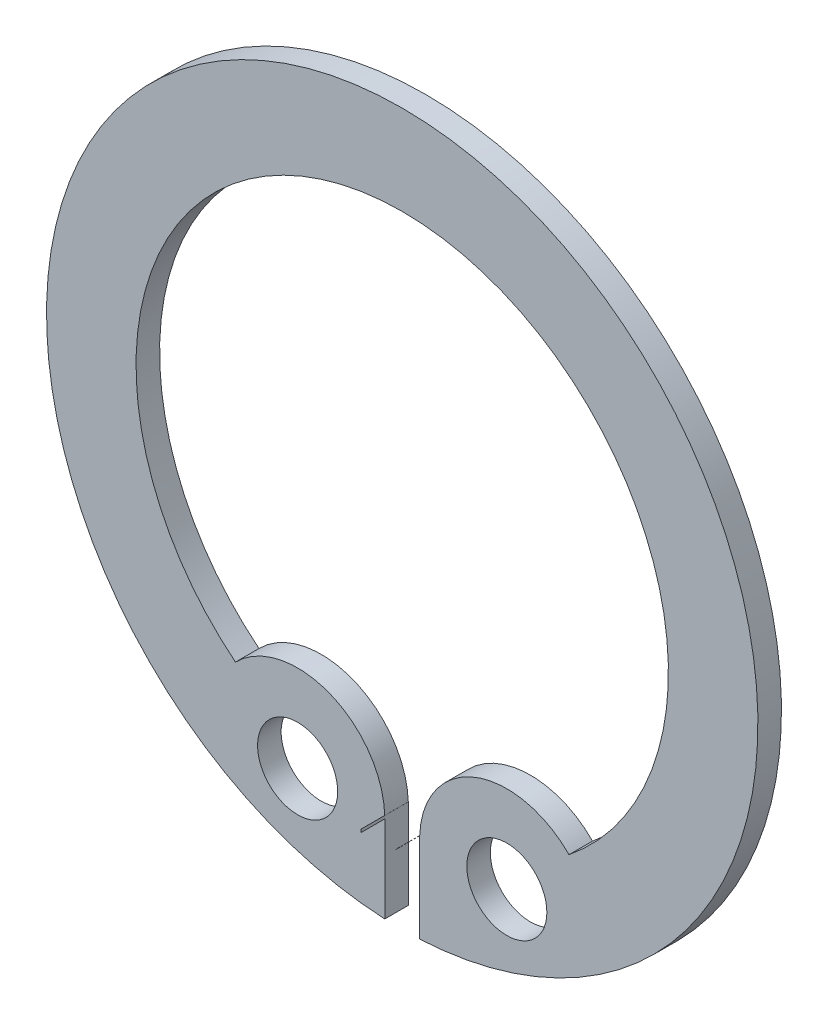
ISO-10303-21;
HEADER;
FILE_DESCRIPTION(('STEP AP214'),'2;1');
FILE_NAME('part.step','',(''),(''),'','','');
FILE_SCHEMA(('AUTOMOTIVE_DESIGN { 1 0 10303 214 1 1 1 1 }'));
ENDSEC;
DATA;
#1=APPLICATION_CONTEXT('core data for automotive mechanical design processes');
#2=APPLICATION_PROTOCOL_DEFINITION('international standard','automotive_design',2000,#1);
#3=PRODUCT_CONTEXT('',#1,'mechanical');
#4=PRODUCT('Part','Part','',(#3));
#5=PRODUCT_RELATED_PRODUCT_CATEGORY('part','',(#4));
#6=PRODUCT_DEFINITION_FORMATION('','',#4);
#7=PRODUCT_DEFINITION_CONTEXT('part definition',#1,'design');
#8=PRODUCT_DEFINITION('design','',#6,#7);
#9=PRODUCT_DEFINITION_SHAPE('','',#8);
#10=(LENGTH_UNIT() NAMED_UNIT(*) SI_UNIT(.MILLI.,.METRE.));
#11=(NAMED_UNIT(*) PLANE_ANGLE_UNIT() SI_UNIT($,.RADIAN.));
#12=(NAMED_UNIT(*) SI_UNIT($,.STERADIAN.) SOLID_ANGLE_UNIT());
#13=UNCERTAINTY_MEASURE_WITH_UNIT(LENGTH_MEASURE(1.E-05),#10,'distance_accuracy_value','');
#14=(GEOMETRIC_REPRESENTATION_CONTEXT(3) GLOBAL_UNCERTAINTY_ASSIGNED_CONTEXT((#13)) GLOBAL_UNIT_ASSIGNED_CONTEXT((#10,
#11,#12)) REPRESENTATION_CONTEXT('',''));
#15=CARTESIAN_POINT('',(0.,0.,0.));
#16=DIRECTION('',(0.,0.,1.));
#17=DIRECTION('',(1.,0.,0.));
#18=AXIS2_PLACEMENT_3D('',#15,#16,#17);
#19=CARTESIAN_POINT('',(2.22,-5.7,0.5));
#20=DIRECTION('',(0.,0.,-1.));
#21=DIRECTION('',(1.,0.,0.));
#22=AXIS2_PLACEMENT_3D('',#19,#20,#21);
#23=CYLINDRICAL_SURFACE('',#22,0.85);
#24=CARTESIAN_POINT('',(2.22,-5.7,0.));
#25=DIRECTION('',(0.,0.,1.));
#26=DIRECTION('',(1.,0.,0.));
#27=AXIS2_PLACEMENT_3D('',#24,#25,#26);
#28=CIRCLE('',#27,0.85);
#29=CARTESIAN_POINT('',(3.07,-5.7,0.));
#30=VERTEX_POINT('',#29);
#31=EDGE_CURVE('E193',#30,#30,#28,.T.);
#32=ORIENTED_EDGE('',*,*,#31,.F.);
#33=EDGE_LOOP('',(#32));
#34=FACE_BOUND('',#33,.T.);
#35=CARTESIAN_POINT('',(2.22,-5.7,0.5));
#36=DIRECTION('',(0.,0.,1.));
#37=DIRECTION('',(1.,0.,0.));
#38=AXIS2_PLACEMENT_3D('',#35,#36,#37);
#39=CIRCLE('',#38,0.85);
#40=CARTESIAN_POINT('',(3.07,-5.7,0.5));
#41=VERTEX_POINT('',#40);
#42=EDGE_CURVE('E371',#41,#41,#39,.T.);
#43=ORIENTED_EDGE('',*,*,#42,.T.);
#44=EDGE_LOOP('',(#43));
#45=FACE_BOUND('',#44,.T.);
#46=ADVANCED_FACE('F39',(#34,#45),#23,.F.);
#47=CARTESIAN_POINT('',(-2.22,-5.7,0.5));
#48=DIRECTION('',(0.,0.,-1.));
#49=DIRECTION('',(1.,0.,0.));
#50=AXIS2_PLACEMENT_3D('',#47,#48,#49);
#51=CYLINDRICAL_SURFACE('',#50,0.85);
#52=CARTESIAN_POINT('',(-2.22,-5.7,0.));
#53=DIRECTION('',(0.,0.,1.));
#54=DIRECTION('',(1.,0.,0.));
#55=AXIS2_PLACEMENT_3D('',#52,#53,#54);
#56=CIRCLE('',#55,0.85);
#57=CARTESIAN_POINT('',(-1.37,-5.7,0.));
#58=VERTEX_POINT('',#57);
#59=EDGE_CURVE('E172',#58,#58,#56,.T.);
#60=ORIENTED_EDGE('',*,*,#59,.F.);
#61=EDGE_LOOP('',(#60));
#62=FACE_BOUND('',#61,.T.);
#63=CARTESIAN_POINT('',(-2.22,-5.7,0.5));
#64=DIRECTION('',(0.,0.,1.));
#65=DIRECTION('',(1.,0.,0.));
#66=AXIS2_PLACEMENT_3D('',#63,#64,#65);
#67=CIRCLE('',#66,0.85);
#68=CARTESIAN_POINT('',(-1.37,-5.7,0.5));
#69=VERTEX_POINT('',#68);
#70=EDGE_CURVE('E205',#69,#69,#67,.T.);
#71=ORIENTED_EDGE('',*,*,#70,.T.);
#72=EDGE_LOOP('',(#71));
#73=FACE_BOUND('',#72,.T.);
#74=ADVANCED_FACE('F281',(#62,#73),#51,.F.);
#75=CARTESIAN_POINT('',(2.22,-5.7,0.5));
#76=DIRECTION('',(0.,0.,-1.));
#77=DIRECTION('',(1.,0.,0.));
#78=AXIS2_PLACEMENT_3D('',#75,#76,#77);
#79=CYLINDRICAL_SURFACE('',#78,1.85);
#80=DIRECTION('',(0.,0.,-1.));
#81=VECTOR('',#80,1.);
#82=CARTESIAN_POINT('',(0.371045820220719,-5.6378032068614,0.5));
#83=LINE('',#82,#81);
#84=CARTESIAN_POINT('',(0.371045820220719,-5.6378032068614,0.5));
#85=VERTEX_POINT('',#84);
#86=CARTESIAN_POINT('',(0.371045820220719,-5.6378032068614,0.));
#87=VERTEX_POINT('',#86);
#88=EDGE_CURVE('E185',#85,#87,#83,.T.);
#89=ORIENTED_EDGE('',*,*,#88,.F.);
#90=CARTESIAN_POINT('',(2.22,-5.7,0.5));
#91=DIRECTION('',(0.,0.,1.));
#92=DIRECTION('',(1.,0.,0.));
#93=AXIS2_PLACEMENT_3D('',#90,#91,#92);
#94=CIRCLE('',#93,1.85);
#95=CARTESIAN_POINT('',(3.53983353325244,-4.40364378178589,0.5));
#96=VERTEX_POINT('',#95);
#97=EDGE_CURVE('E57',#85,#96,#94,.F.);
#98=ORIENTED_EDGE('',*,*,#97,.T.);
#99=DIRECTION('',(0.,0.,1.));
#100=VECTOR('',#99,1.);
#101=CARTESIAN_POINT('',(3.53983353325244,-4.40364378178589,0.5));
#102=LINE('',#101,#100);
#103=CARTESIAN_POINT('',(3.53983353325244,-4.40364378178589,0.));
#104=VERTEX_POINT('',#103);
#105=EDGE_CURVE('E173',#104,#96,#102,.T.);
#106=ORIENTED_EDGE('',*,*,#105,.F.);
#107=CARTESIAN_POINT('',(2.22,-5.7,0.));
#108=DIRECTION('',(0.,0.,1.));
#109=DIRECTION('',(1.,0.,0.));
#110=AXIS2_PLACEMENT_3D('',#107,#108,#109);
#111=CIRCLE('',#110,1.85);
#112=EDGE_CURVE('E162',#104,#87,#111,.T.);
#113=ORIENTED_EDGE('',*,*,#112,.T.);
#114=EDGE_LOOP('',(#89,#98,#106,#113));
#115=FACE_BOUND('',#114,.T.);
#116=ADVANCED_FACE('F215',(#115),#79,.T.);
#117=CARTESIAN_POINT('',(0.,0.,1.));
#118=DIRECTION('',(0.,0.,1.));
#119=DIRECTION('',(1.,0.,0.));
#120=AXIS2_PLACEMENT_3D('',#117,#118,#119);
#121=PLANE('',#120);
#122=CARTESIAN_POINT('',(2.22,-5.7,1.));
#123=DIRECTION('',(0.,0.,1.));
#124=DIRECTION('',(1.,0.,0.));
#125=AXIS2_PLACEMENT_3D('',#122,#123,#124);
#126=CIRCLE('',#125,1.85093904122967);
#127=CARTESIAN_POINT('',(0.370104168133009,-5.63786510167905,1.));
#128=VERTEX_POINT('',#127);
#129=CARTESIAN_POINT('',(0.370000000000001,-5.64104803355083,1.));
#130=VERTEX_POINT('',#129);
#131=EDGE_CURVE('E201',#128,#130,#126,.T.);
#132=ORIENTED_EDGE('',*,*,#131,.F.);
#133=CARTESIAN_POINT('',(0.,0.,1.));
#134=DIRECTION('',(0.,0.,-1.));
#135=DIRECTION('',(1.,0.,0.));
#136=AXIS2_PLACEMENT_3D('',#133,#134,#135);
#137=CIRCLE('',#136,5.65);
#138=CARTESIAN_POINT('',(0.37,-5.63787193895001,1.));
#139=VERTEX_POINT('',#138);
#140=EDGE_CURVE('E180',#128,#139,#137,.T.);
#141=ORIENTED_EDGE('',*,*,#140,.T.);
#142=DIRECTION('',(0.,-1.,0.));
#143=VECTOR('',#142,1.);
#144=CARTESIAN_POINT('',(0.37,-3.29696798473751,1.));
#145=LINE('',#144,#143);
#146=EDGE_CURVE('E183',#139,#130,#145,.T.);
#147=ORIENTED_EDGE('',*,*,#146,.T.);
#148=EDGE_LOOP('',(#132,#141,#147));
#149=FACE_BOUND('',#148,.T.);
#150=ADVANCED_FACE('F238',(#149),#121,.T.);
#151=CARTESIAN_POINT('',(0.,0.,0.));
#152=DIRECTION('',(0.,0.,-1.));
#153=DIRECTION('',(1.,0.,0.));
#154=AXIS2_PLACEMENT_3D('',#151,#152,#153);
#155=CYLINDRICAL_SURFACE('',#154,5.65);
#156=ORIENTED_EDGE('',*,*,#105,.T.);
#157=CARTESIAN_POINT('',(0.,0.,0.5));
#158=DIRECTION('',(0.,0.,-1.));
#159=DIRECTION('',(1.,0.,0.));
#160=AXIS2_PLACEMENT_3D('',#157,#158,#159);
#161=CIRCLE('',#160,5.65);
#162=CARTESIAN_POINT('',(-3.53983353325244,-4.40364378178589,0.5));
#163=VERTEX_POINT('',#162);
#164=EDGE_CURVE('E209',#163,#96,#161,.T.);
#165=ORIENTED_EDGE('',*,*,#164,.F.);
#166=DIRECTION('',(0.,0.,-1.));
#167=VECTOR('',#166,1.);
#168=CARTESIAN_POINT('',(-3.53983353325244,-4.40364378178589,0.5));
#169=LINE('',#168,#167);
#170=CARTESIAN_POINT('',(-3.53983353325244,-4.40364378178589,0.));
#171=VERTEX_POINT('',#170);
#172=EDGE_CURVE('E176',#163,#171,#169,.T.);
#173=ORIENTED_EDGE('',*,*,#172,.T.);
#174=CARTESIAN_POINT('',(0.,0.,0.));
#175=DIRECTION('',(0.,0.,1.));
#176=DIRECTION('',(1.,0.,0.));
#177=AXIS2_PLACEMENT_3D('',#174,#175,#176);
#178=CIRCLE('',#177,5.65);
#179=EDGE_CURVE('E166',#104,#171,#178,.T.);
#180=ORIENTED_EDGE('',*,*,#179,.F.);
#181=EDGE_LOOP('',(#156,#165,#173,#180));
#182=FACE_BOUND('',#181,.T.);
#183=ADVANCED_FACE('F220',(#182),#155,.F.);
#184=CARTESIAN_POINT('',(-2.22,-5.7,0.5));
#185=DIRECTION('',(0.,0.,-1.));
#186=DIRECTION('',(1.,0.,0.));
#187=AXIS2_PLACEMENT_3D('',#184,#185,#186);
#188=CYLINDRICAL_SURFACE('',#187,1.85);
#189=ORIENTED_EDGE('',*,*,#172,.F.);
#190=CARTESIAN_POINT('',(-2.22,-5.7,0.5));
#191=DIRECTION('',(0.,0.,1.));
#192=DIRECTION('',(1.,0.,0.));
#193=AXIS2_PLACEMENT_3D('',#190,#191,#192);
#194=CIRCLE('',#193,1.85);
#195=CARTESIAN_POINT('',(-0.371045820220717,-5.6378032068614,0.5));
#196=VERTEX_POINT('',#195);
#197=EDGE_CURVE('E264',#196,#163,#194,.T.);
#198=ORIENTED_EDGE('',*,*,#197,.F.);
#199=DIRECTION('',(0.,0.,1.));
#200=VECTOR('',#199,1.);
#201=CARTESIAN_POINT('',(-0.371045820220719,-5.6378032068614,0.5));
#202=LINE('',#201,#200);
#203=CARTESIAN_POINT('',(-0.371045820220719,-5.6378032068614,0.));
#204=VERTEX_POINT('',#203);
#205=EDGE_CURVE('E151',#204,#196,#202,.T.);
#206=ORIENTED_EDGE('',*,*,#205,.F.);
#207=CARTESIAN_POINT('',(-2.22,-5.7,0.));
#208=DIRECTION('',(0.,0.,1.));
#209=DIRECTION('',(1.,0.,0.));
#210=AXIS2_PLACEMENT_3D('',#207,#208,#209);
#211=CIRCLE('',#210,1.85);
#212=EDGE_CURVE('E153',#204,#171,#211,.T.);
#213=ORIENTED_EDGE('',*,*,#212,.T.);
#214=EDGE_LOOP('',(#189,#198,#206,#213));
#215=FACE_BOUND('',#214,.T.);
#216=ADVANCED_FACE('F269',(#215),#188,.T.);
#217=CARTESIAN_POINT('',(0.,0.,0.5));
#218=DIRECTION('',(0.,0.,-1.));
#219=DIRECTION('',(1.,0.,0.));
#220=AXIS2_PLACEMENT_3D('',#217,#218,#219);
#221=CYLINDRICAL_SURFACE('',#220,7.55);
#222=DIRECTION('',(0.,0.,1.));
#223=VECTOR('',#222,1.);
#224=CARTESIAN_POINT('',(-0.37,-7.54092832481519,0.5));
#225=LINE('',#224,#223);
#226=CARTESIAN_POINT('',(-0.37,-7.54092832481519,0.));
#227=VERTEX_POINT('',#226);
#228=CARTESIAN_POINT('',(-0.37,-7.54092832481519,0.5));
#229=VERTEX_POINT('',#228);
#230=EDGE_CURVE('E144',#227,#229,#225,.T.);
#231=ORIENTED_EDGE('',*,*,#230,.T.);
#232=CARTESIAN_POINT('',(0.,0.,0.5));
#233=DIRECTION('',(0.,0.,1.));
#234=DIRECTION('',(1.,0.,0.));
#235=AXIS2_PLACEMENT_3D('',#232,#233,#234);
#236=CIRCLE('',#235,7.55);
#237=CARTESIAN_POINT('',(0.37,-7.54092832481519,0.5));
#238=VERTEX_POINT('',#237);
#239=EDGE_CURVE('E130',#238,#229,#236,.T.);
#240=ORIENTED_EDGE('',*,*,#239,.F.);
#241=DIRECTION('',(0.,0.,-1.));
#242=VECTOR('',#241,1.);
#243=CARTESIAN_POINT('',(0.37,-7.54092832481519,0.5));
#244=LINE('',#243,#242);
#245=CARTESIAN_POINT('',(0.37,-7.54092832481519,0.));
#246=VERTEX_POINT('',#245);
#247=EDGE_CURVE('E141',#238,#246,#244,.T.);
#248=ORIENTED_EDGE('',*,*,#247,.T.);
#249=CARTESIAN_POINT('',(0.,0.,0.));
#250=DIRECTION('',(0.,0.,-1.));
#251=DIRECTION('',(1.,0.,0.));
#252=AXIS2_PLACEMENT_3D('',#249,#250,#251);
#253=CIRCLE('',#252,7.55);
#254=EDGE_CURVE('E160',#227,#246,#253,.T.);
#255=ORIENTED_EDGE('',*,*,#254,.F.);
#256=EDGE_LOOP('',(#231,#240,#248,#255));
#257=FACE_BOUND('',#256,.T.);
#258=ADVANCED_FACE('F140',(#257),#221,.T.);
#259=CARTESIAN_POINT('',(-0.37,-6.59393596947501,0.));
#260=DIRECTION('',(-1.,0.,0.));
#261=DIRECTION('',(0.,-1.,0.));
#262=AXIS2_PLACEMENT_3D('',#259,#260,#261);
#263=PLANE('',#262);
#264=DIRECTION('',(0.,0.,1.));
#265=VECTOR('',#264,1.);
#266=CARTESIAN_POINT('',(-0.369999999999998,-5.7,0.5));
#267=LINE('',#266,#265);
#268=CARTESIAN_POINT('',(-0.369999999999998,-5.7,0.5));
#269=VERTEX_POINT('',#268);
#270=CARTESIAN_POINT('',(-0.369999999999998,-5.7,1.));
#271=VERTEX_POINT('',#270);
#272=EDGE_CURVE('E212',#269,#271,#267,.T.);
#273=ORIENTED_EDGE('',*,*,#272,.F.);
#274=DIRECTION('',(0.,1.,0.));
#275=VECTOR('',#274,1.);
#276=CARTESIAN_POINT('',(-0.369999999999998,-5.7,0.5));
#277=LINE('',#276,#275);
#278=EDGE_CURVE('E145',#229,#269,#277,.T.);
#279=ORIENTED_EDGE('',*,*,#278,.F.);
#280=ORIENTED_EDGE('',*,*,#230,.F.);
#281=DIRECTION('',(0.,-1.,0.));
#282=VECTOR('',#281,1.);
#283=CARTESIAN_POINT('',(-0.37,-3.29696798473751,0.));
#284=LINE('',#283,#282);
#285=CARTESIAN_POINT('',(-0.37,-5.63787193895001,0.));
#286=VERTEX_POINT('',#285);
#287=EDGE_CURVE('E179',#286,#227,#284,.T.);
#288=ORIENTED_EDGE('',*,*,#287,.F.);
#289=DIRECTION('',(0.,0.,1.));
#290=VECTOR('',#289,1.);
#291=CARTESIAN_POINT('',(-0.37,-5.63787193895001,0.));
#292=LINE('',#291,#290);
#293=CARTESIAN_POINT('',(-0.37,-5.63787193895001,1.));
#294=VERTEX_POINT('',#293);
#295=EDGE_CURVE('E156',#286,#294,#292,.T.);
#296=ORIENTED_EDGE('',*,*,#295,.T.);
#297=DIRECTION('',(0.,1.,0.));
#298=VECTOR('',#297,1.);
#299=CARTESIAN_POINT('',(-0.37,-3.29696798473751,1.));
#300=LINE('',#299,#298);
#301=EDGE_CURVE('E165',#271,#294,#300,.T.);
#302=ORIENTED_EDGE('',*,*,#301,.F.);
#303=EDGE_LOOP('',(#273,#279,#280,#288,#296,#302));
#304=FACE_BOUND('',#303,.T.);
#305=ADVANCED_FACE('F263',(#304),#263,.F.);
#306=CARTESIAN_POINT('',(0.37,-6.59393596947501,0.));
#307=DIRECTION('',(1.,0.,0.));
#308=DIRECTION('',(0.,1.,0.));
#309=AXIS2_PLACEMENT_3D('',#306,#307,#308);
#310=PLANE('',#309);
#311=DIRECTION('',(0.,1.,0.));
#312=VECTOR('',#311,1.);
#313=CARTESIAN_POINT('',(0.37,-5.7,0.5));
#314=LINE('',#313,#312);
#315=CARTESIAN_POINT('',(0.37,-5.64104803355086,0.5));
#316=VERTEX_POINT('',#315);
#317=EDGE_CURVE('E43',#316,#238,#314,.F.);
#318=ORIENTED_EDGE('',*,*,#317,.F.);
#319=DIRECTION('',(0.,0.,1.));
#320=VECTOR('',#319,1.);
#321=CARTESIAN_POINT('',(0.37,-5.64104803355086,0.5));
#322=LINE('',#321,#320);
#323=EDGE_CURVE('E137',#316,#130,#322,.T.);
#324=ORIENTED_EDGE('',*,*,#323,.T.);
#325=ORIENTED_EDGE('',*,*,#146,.F.);
#326=DIRECTION('',(0.,0.,1.));
#327=VECTOR('',#326,1.);
#328=CARTESIAN_POINT('',(0.37,-5.63787193895001,0.));
#329=LINE('',#328,#327);
#330=CARTESIAN_POINT('',(0.37,-5.63787193895001,0.));
#331=VERTEX_POINT('',#330);
#332=EDGE_CURVE('E187',#331,#139,#329,.T.);
#333=ORIENTED_EDGE('',*,*,#332,.F.);
#334=DIRECTION('',(0.,1.,0.));
#335=VECTOR('',#334,1.);
#336=CARTESIAN_POINT('',(0.37,-3.29696798473751,0.));
#337=LINE('',#336,#335);
#338=EDGE_CURVE('E149',#246,#331,#337,.T.);
#339=ORIENTED_EDGE('',*,*,#338,.F.);
#340=ORIENTED_EDGE('',*,*,#247,.F.);
#341=EDGE_LOOP('',(#318,#324,#325,#333,#339,#340));
#342=FACE_BOUND('',#341,.T.);
#343=ADVANCED_FACE('F147',(#342),#310,.F.);
#344=CARTESIAN_POINT('',(-2.22,-5.7,1.));
#345=DIRECTION('',(0.,0.,1.));
#346=DIRECTION('',(1.,0.,0.));
#347=AXIS2_PLACEMENT_3D('',#344,#345,#346);
#348=CIRCLE('',#347,1.85);
#349=CARTESIAN_POINT('',(-0.371045820220717,-5.6378032068614,1.));
#350=VERTEX_POINT('',#349);
#351=EDGE_CURVE('E204',#271,#350,#348,.T.);
#352=ORIENTED_EDGE('',*,*,#351,.F.);
#353=ORIENTED_EDGE('',*,*,#301,.T.);
#354=CARTESIAN_POINT('',(0.,0.,1.));
#355=DIRECTION('',(0.,0.,-1.));
#356=DIRECTION('',(1.,0.,0.));
#357=AXIS2_PLACEMENT_3D('',#354,#355,#356);
#358=CIRCLE('',#357,5.65);
#359=EDGE_CURVE('E182',#294,#350,#358,.T.);
#360=ORIENTED_EDGE('',*,*,#359,.T.);
#361=EDGE_LOOP('',(#352,#353,#360));
#362=FACE_BOUND('',#361,.T.);
#363=ADVANCED_FACE('F251',(#362),#121,.T.);
#364=CARTESIAN_POINT('',(0.,0.,0.));
#365=DIRECTION('',(0.,0.,-1.));
#366=DIRECTION('',(-1.,0.,0.));
#367=AXIS2_PLACEMENT_3D('',#364,#365,#366);
#368=PLANE('',#367);
#369=ORIENTED_EDGE('',*,*,#31,.T.);
#370=EDGE_LOOP('',(#369));
#371=FACE_BOUND('',#370,.T.);
#372=ORIENTED_EDGE('',*,*,#59,.T.);
#373=EDGE_LOOP('',(#372));
#374=FACE_BOUND('',#373,.T.);
#375=ORIENTED_EDGE('',*,*,#338,.T.);
#376=CARTESIAN_POINT('',(0.,0.,0.));
#377=DIRECTION('',(0.,0.,1.));
#378=DIRECTION('',(1.,0.,0.));
#379=AXIS2_PLACEMENT_3D('',#376,#377,#378);
#380=CIRCLE('',#379,5.65);
#381=EDGE_CURVE('E169',#331,#87,#380,.T.);
#382=ORIENTED_EDGE('',*,*,#381,.T.);
#383=ORIENTED_EDGE('',*,*,#112,.F.);
#384=ORIENTED_EDGE('',*,*,#179,.T.);
#385=ORIENTED_EDGE('',*,*,#212,.F.);
#386=CARTESIAN_POINT('',(0.,0.,0.));
#387=DIRECTION('',(0.,0.,1.));
#388=DIRECTION('',(1.,0.,0.));
#389=AXIS2_PLACEMENT_3D('',#386,#387,#388);
#390=CIRCLE('',#389,5.65);
#391=EDGE_CURVE('E170',#204,#286,#390,.T.);
#392=ORIENTED_EDGE('',*,*,#391,.T.);
#393=ORIENTED_EDGE('',*,*,#287,.T.);
#394=ORIENTED_EDGE('',*,*,#254,.T.);
#395=EDGE_LOOP('',(#375,#382,#383,#384,#385,#392,#393,#394));
#396=FACE_BOUND('',#395,.T.);
#397=ADVANCED_FACE('F224',(#371,#374,#396),#368,.T.);
#398=CARTESIAN_POINT('',(0.,0.,0.));
#399=DIRECTION('',(0.,0.,-1.));
#400=DIRECTION('',(1.,0.,0.));
#401=AXIS2_PLACEMENT_3D('',#398,#399,#400);
#402=CYLINDRICAL_SURFACE('',#401,5.65);
#403=ORIENTED_EDGE('',*,*,#205,.T.);
#404=DIRECTION('',(0.,0.,1.));
#405=VECTOR('',#404,1.);
#406=CARTESIAN_POINT('',(-0.371045820220717,-5.6378032068614,0.75));
#407=LINE('',#406,#405);
#408=EDGE_CURVE('E199',#196,#350,#407,.T.);
#409=ORIENTED_EDGE('',*,*,#408,.T.);
#410=ORIENTED_EDGE('',*,*,#359,.F.);
#411=ORIENTED_EDGE('',*,*,#295,.F.);
#412=ORIENTED_EDGE('',*,*,#391,.F.);
#413=EDGE_LOOP('',(#403,#409,#410,#411,#412));
#414=FACE_BOUND('',#413,.T.);
#415=ADVANCED_FACE('F243',(#414),#402,.F.);
#416=CARTESIAN_POINT('',(0.,0.,0.));
#417=DIRECTION('',(0.,0.,-1.));
#418=DIRECTION('',(1.,0.,0.));
#419=AXIS2_PLACEMENT_3D('',#416,#417,#418);
#420=CYLINDRICAL_SURFACE('',#419,5.65);
#421=ORIENTED_EDGE('',*,*,#140,.F.);
#422=DIRECTION('',(0.,0.,1.));
#423=VECTOR('',#422,1.);
#424=CARTESIAN_POINT('',(0.370104168133009,-5.63786510167905,0.75));
#425=LINE('',#424,#423);
#426=CARTESIAN_POINT('',(0.370104168133009,-5.63786510167905,0.5));
#427=VERTEX_POINT('',#426);
#428=EDGE_CURVE('E11',#128,#427,#425,.F.);
#429=ORIENTED_EDGE('',*,*,#428,.T.);
#430=CARTESIAN_POINT('',(0.,0.,0.5));
#431=DIRECTION('',(0.,0.,1.));
#432=DIRECTION('',(1.,0.,0.));
#433=AXIS2_PLACEMENT_3D('',#430,#431,#432);
#434=CIRCLE('',#433,5.65);
#435=EDGE_CURVE('E49',#85,#427,#434,.F.);
#436=ORIENTED_EDGE('',*,*,#435,.F.);
#437=ORIENTED_EDGE('',*,*,#88,.T.);
#438=ORIENTED_EDGE('',*,*,#381,.F.);
#439=ORIENTED_EDGE('',*,*,#332,.T.);
#440=EDGE_LOOP('',(#421,#429,#436,#437,#438,#439));
#441=FACE_BOUND('',#440,.T.);
#442=ADVANCED_FACE('F41',(#441),#420,.F.);
#443=CARTESIAN_POINT('',(-2.22,-5.7,0.5));
#444=DIRECTION('',(0.,0.,1.));
#445=DIRECTION('',(1.,0.,0.));
#446=AXIS2_PLACEMENT_3D('',#443,#444,#445);
#447=CYLINDRICAL_SURFACE('',#446,1.85);
#448=EDGE_CURVE('E266',#269,#196,#194,.T.);
#449=ORIENTED_EDGE('',*,*,#448,.F.);
#450=ORIENTED_EDGE('',*,*,#272,.T.);
#451=ORIENTED_EDGE('',*,*,#351,.T.);
#452=ORIENTED_EDGE('',*,*,#408,.F.);
#453=EDGE_LOOP('',(#449,#450,#451,#452));
#454=FACE_BOUND('',#453,.T.);
#455=ADVANCED_FACE('F332',(#454),#447,.F.);
#456=CARTESIAN_POINT('',(2.22,-5.7,0.5));
#457=DIRECTION('',(0.,0.,1.));
#458=DIRECTION('',(1.,0.,0.));
#459=AXIS2_PLACEMENT_3D('',#456,#457,#458);
#460=CYLINDRICAL_SURFACE('',#459,1.85093904122967);
#461=CARTESIAN_POINT('',(2.22,-5.7,0.5));
#462=DIRECTION('',(0.,0.,1.));
#463=DIRECTION('',(1.,0.,0.));
#464=AXIS2_PLACEMENT_3D('',#461,#462,#463);
#465=CIRCLE('',#464,1.85093904122967);
#466=EDGE_CURVE('E133',#427,#316,#465,.T.);
#467=ORIENTED_EDGE('',*,*,#466,.F.);
#468=ORIENTED_EDGE('',*,*,#428,.F.);
#469=ORIENTED_EDGE('',*,*,#131,.T.);
#470=ORIENTED_EDGE('',*,*,#323,.F.);
#471=EDGE_LOOP('',(#467,#468,#469,#470));
#472=FACE_BOUND('',#471,.T.);
#473=ADVANCED_FACE('F232',(#472),#460,.F.);
#474=CARTESIAN_POINT('',(2.22,-5.7,0.5));
#475=DIRECTION('',(0.,0.,1.));
#476=DIRECTION('',(1.,0.,0.));
#477=AXIS2_PLACEMENT_3D('',#474,#475,#476);
#478=PLANE('',#477);
#479=ORIENTED_EDGE('',*,*,#42,.F.);
#480=EDGE_LOOP('',(#479));
#481=FACE_BOUND('',#480,.T.);
#482=ORIENTED_EDGE('',*,*,#70,.F.);
#483=EDGE_LOOP('',(#482));
#484=FACE_BOUND('',#483,.T.);
#485=ORIENTED_EDGE('',*,*,#317,.T.);
#486=ORIENTED_EDGE('',*,*,#239,.T.);
#487=ORIENTED_EDGE('',*,*,#278,.T.);
#488=ORIENTED_EDGE('',*,*,#448,.T.);
#489=ORIENTED_EDGE('',*,*,#197,.T.);
#490=ORIENTED_EDGE('',*,*,#164,.T.);
#491=ORIENTED_EDGE('',*,*,#97,.F.);
#492=ORIENTED_EDGE('',*,*,#435,.T.);
#493=ORIENTED_EDGE('',*,*,#466,.T.);
#494=EDGE_LOOP('',(#485,#486,#487,#488,#489,#490,#491,#492,#493));
#495=FACE_BOUND('',#494,.T.);
#496=ADVANCED_FACE('F128',(#481,#484,#495),#478,.T.);
#497=CLOSED_SHELL('',(#46,#74,#116,#150,#183,#216,#258,#305,#343,#363,#397,#415,#442,#455,#473,#496));
#498=MANIFOLD_SOLID_BREP('B2',#497);
#499=ADVANCED_BREP_SHAPE_REPRESENTATION('',(#18,#498),#14);
#500=SHAPE_DEFINITION_REPRESENTATION(#9,#499);
ENDSEC;
END-ISO-10303-21;
